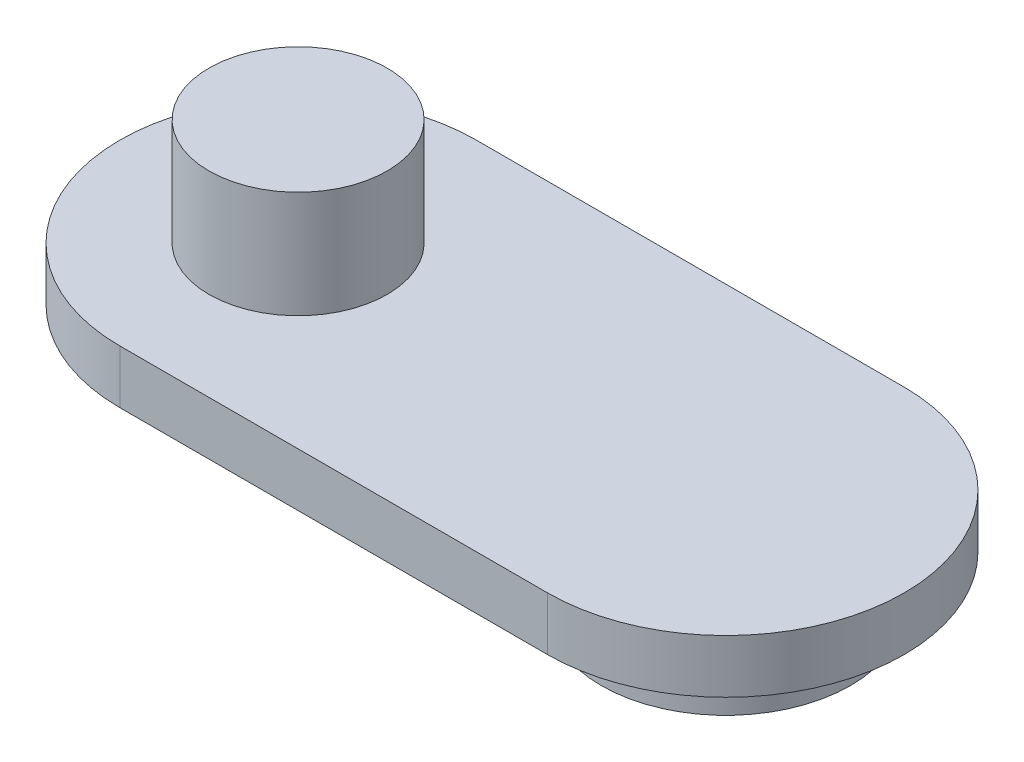
ISO-10303-21;
HEADER;
FILE_DESCRIPTION(('STEP AP214'),'2;1');
FILE_NAME('part.step','',(''),(''),'','','');
FILE_SCHEMA(('AUTOMOTIVE_DESIGN { 1 0 10303 214 1 1 1 1 }'));
ENDSEC;
DATA;
#1=APPLICATION_CONTEXT('core data for automotive mechanical design processes');
#2=APPLICATION_PROTOCOL_DEFINITION('international standard','automotive_design',2000,#1);
#3=PRODUCT_CONTEXT('',#1,'mechanical');
#4=PRODUCT('Part','Part','',(#3));
#5=PRODUCT_RELATED_PRODUCT_CATEGORY('part','',(#4));
#6=PRODUCT_DEFINITION_FORMATION('','',#4);
#7=PRODUCT_DEFINITION_CONTEXT('part definition',#1,'design');
#8=PRODUCT_DEFINITION('design','',#6,#7);
#9=PRODUCT_DEFINITION_SHAPE('','',#8);
#10=(LENGTH_UNIT() NAMED_UNIT(*) SI_UNIT(.MILLI.,.METRE.));
#11=(NAMED_UNIT(*) PLANE_ANGLE_UNIT() SI_UNIT($,.RADIAN.));
#12=(NAMED_UNIT(*) SI_UNIT($,.STERADIAN.) SOLID_ANGLE_UNIT());
#13=UNCERTAINTY_MEASURE_WITH_UNIT(LENGTH_MEASURE(1.E-05),#10,'distance_accuracy_value','');
#14=(GEOMETRIC_REPRESENTATION_CONTEXT(3) GLOBAL_UNCERTAINTY_ASSIGNED_CONTEXT((#13)) GLOBAL_UNIT_ASSIGNED_CONTEXT((#10,
#11,#12)) REPRESENTATION_CONTEXT('',''));
#15=CARTESIAN_POINT('',(0.,0.,0.));
#16=DIRECTION('',(0.,0.,1.));
#17=DIRECTION('',(1.,0.,0.));
#18=AXIS2_PLACEMENT_3D('',#15,#16,#17);
#19=CARTESIAN_POINT('',(0.,1.5,0.));
#20=DIRECTION('',(0.,-1.,0.));
#21=DIRECTION('',(0.,0.,-1.));
#22=AXIS2_PLACEMENT_3D('',#19,#20,#21);
#23=CYLINDRICAL_SURFACE('',#22,5.);
#24=CARTESIAN_POINT('',(0.,0.,0.));
#25=DIRECTION('',(0.,1.,0.));
#26=DIRECTION('',(0.,0.,1.));
#27=AXIS2_PLACEMENT_3D('',#24,#25,#26);
#28=CIRCLE('',#27,5.);
#29=CARTESIAN_POINT('',(0.,0.,-5.));
#30=VERTEX_POINT('',#29);
#31=CARTESIAN_POINT('',(0.,0.,5.));
#32=VERTEX_POINT('',#31);
#33=EDGE_CURVE('E102',#30,#32,#28,.T.);
#34=ORIENTED_EDGE('',*,*,#33,.T.);
#35=DIRECTION('',(0.,-1.,0.));
#36=VECTOR('',#35,1.);
#37=CARTESIAN_POINT('',(0.,1.5,5.));
#38=LINE('',#37,#36);
#39=CARTESIAN_POINT('',(0.,1.5,5.));
#40=VERTEX_POINT('',#39);
#41=EDGE_CURVE('E44',#40,#32,#38,.T.);
#42=ORIENTED_EDGE('',*,*,#41,.F.);
#43=CARTESIAN_POINT('',(0.,1.5,0.));
#44=DIRECTION('',(0.,1.,0.));
#45=DIRECTION('',(0.,0.,1.));
#46=AXIS2_PLACEMENT_3D('',#43,#44,#45);
#47=CIRCLE('',#46,5.);
#48=CARTESIAN_POINT('',(0.,1.5,-5.));
#49=VERTEX_POINT('',#48);
#50=EDGE_CURVE('E88',#49,#40,#47,.T.);
#51=ORIENTED_EDGE('',*,*,#50,.F.);
#52=DIRECTION('',(0.,-1.,0.));
#53=VECTOR('',#52,1.);
#54=CARTESIAN_POINT('',(0.,1.5,-5.));
#55=LINE('',#54,#53);
#56=EDGE_CURVE('E98',#49,#30,#55,.T.);
#57=ORIENTED_EDGE('',*,*,#56,.T.);
#58=EDGE_LOOP('',(#34,#42,#51,#57));
#59=FACE_BOUND('',#58,.T.);
#60=ADVANCED_FACE('F36',(#59),#23,.T.);
#61=CARTESIAN_POINT('',(0.,1.5,5.));
#62=DIRECTION('',(0.,0.,-1.));
#63=DIRECTION('',(-1.,0.,0.));
#64=AXIS2_PLACEMENT_3D('',#61,#62,#63);
#65=PLANE('',#64);
#66=DIRECTION('',(1.,0.,0.));
#67=VECTOR('',#66,1.);
#68=CARTESIAN_POINT('',(0.,0.,5.));
#69=LINE('',#68,#67);
#70=CARTESIAN_POINT('',(12.,0.,5.));
#71=VERTEX_POINT('',#70);
#72=EDGE_CURVE('E93',#32,#71,#69,.T.);
#73=ORIENTED_EDGE('',*,*,#72,.T.);
#74=DIRECTION('',(0.,-1.,0.));
#75=VECTOR('',#74,1.);
#76=CARTESIAN_POINT('',(12.,1.5,5.));
#77=LINE('',#76,#75);
#78=CARTESIAN_POINT('',(12.,1.5,5.));
#79=VERTEX_POINT('',#78);
#80=EDGE_CURVE('E91',#79,#71,#77,.T.);
#81=ORIENTED_EDGE('',*,*,#80,.F.);
#82=DIRECTION('',(1.,0.,0.));
#83=VECTOR('',#82,1.);
#84=CARTESIAN_POINT('',(0.,1.5,5.));
#85=LINE('',#84,#83);
#86=EDGE_CURVE('E83',#40,#79,#85,.T.);
#87=ORIENTED_EDGE('',*,*,#86,.F.);
#88=ORIENTED_EDGE('',*,*,#41,.T.);
#89=EDGE_LOOP('',(#73,#81,#87,#88));
#90=FACE_BOUND('',#89,.T.);
#91=ADVANCED_FACE('F92',(#90),#65,.F.);
#92=CARTESIAN_POINT('',(12.,1.5,0.));
#93=DIRECTION('',(0.,-1.,0.));
#94=DIRECTION('',(0.,0.,-1.));
#95=AXIS2_PLACEMENT_3D('',#92,#93,#94);
#96=CYLINDRICAL_SURFACE('',#95,5.);
#97=CARTESIAN_POINT('',(12.,0.,0.));
#98=DIRECTION('',(0.,1.,0.));
#99=DIRECTION('',(0.,0.,1.));
#100=AXIS2_PLACEMENT_3D('',#97,#98,#99);
#101=CIRCLE('',#100,5.);
#102=CARTESIAN_POINT('',(12.,0.,-5.));
#103=VERTEX_POINT('',#102);
#104=EDGE_CURVE('E69',#71,#103,#101,.T.);
#105=ORIENTED_EDGE('',*,*,#104,.T.);
#106=DIRECTION('',(0.,-1.,0.));
#107=VECTOR('',#106,1.);
#108=CARTESIAN_POINT('',(12.,1.5,-5.));
#109=LINE('',#108,#107);
#110=CARTESIAN_POINT('',(12.,1.5,-5.));
#111=VERTEX_POINT('',#110);
#112=EDGE_CURVE('E94',#111,#103,#109,.T.);
#113=ORIENTED_EDGE('',*,*,#112,.F.);
#114=CARTESIAN_POINT('',(12.,1.5,0.));
#115=DIRECTION('',(0.,1.,0.));
#116=DIRECTION('',(0.,0.,1.));
#117=AXIS2_PLACEMENT_3D('',#114,#115,#116);
#118=CIRCLE('',#117,5.);
#119=EDGE_CURVE('E86',#79,#111,#118,.T.);
#120=ORIENTED_EDGE('',*,*,#119,.F.);
#121=ORIENTED_EDGE('',*,*,#80,.T.);
#122=EDGE_LOOP('',(#105,#113,#120,#121));
#123=FACE_BOUND('',#122,.T.);
#124=ADVANCED_FACE('F96',(#123),#96,.T.);
#125=CARTESIAN_POINT('',(0.,1.5,-5.));
#126=DIRECTION('',(0.,0.,1.));
#127=DIRECTION('',(1.,0.,0.));
#128=AXIS2_PLACEMENT_3D('',#125,#126,#127);
#129=PLANE('',#128);
#130=DIRECTION('',(-1.,0.,0.));
#131=VECTOR('',#130,1.);
#132=CARTESIAN_POINT('',(0.,0.,-5.));
#133=LINE('',#132,#131);
#134=EDGE_CURVE('E75',#103,#30,#133,.T.);
#135=ORIENTED_EDGE('',*,*,#134,.T.);
#136=ORIENTED_EDGE('',*,*,#56,.F.);
#137=DIRECTION('',(-1.,0.,0.));
#138=VECTOR('',#137,1.);
#139=CARTESIAN_POINT('',(0.,1.5,-5.));
#140=LINE('',#139,#138);
#141=EDGE_CURVE('E52',#111,#49,#140,.T.);
#142=ORIENTED_EDGE('',*,*,#141,.F.);
#143=ORIENTED_EDGE('',*,*,#112,.T.);
#144=EDGE_LOOP('',(#135,#136,#142,#143));
#145=FACE_BOUND('',#144,.T.);
#146=ADVANCED_FACE('F125',(#145),#129,.F.);
#147=CARTESIAN_POINT('',(0.,1.5,0.));
#148=DIRECTION('',(0.,1.,0.));
#149=DIRECTION('',(0.,0.,1.));
#150=AXIS2_PLACEMENT_3D('',#147,#148,#149);
#151=PLANE('',#150);
#152=CARTESIAN_POINT('',(0.,1.5,0.));
#153=DIRECTION('',(0.,1.,0.));
#154=DIRECTION('',(0.,0.,1.));
#155=AXIS2_PLACEMENT_3D('',#152,#153,#154);
#156=CIRCLE('',#155,2.5);
#157=CARTESIAN_POINT('',(0.,1.5,2.5));
#158=VERTEX_POINT('',#157);
#159=EDGE_CURVE('E185',#158,#158,#156,.T.);
#160=ORIENTED_EDGE('',*,*,#159,.F.);
#161=EDGE_LOOP('',(#160));
#162=FACE_BOUND('',#161,.T.);
#163=ORIENTED_EDGE('',*,*,#50,.T.);
#164=ORIENTED_EDGE('',*,*,#86,.T.);
#165=ORIENTED_EDGE('',*,*,#119,.T.);
#166=ORIENTED_EDGE('',*,*,#141,.T.);
#167=EDGE_LOOP('',(#163,#164,#165,#166));
#168=FACE_BOUND('',#167,.T.);
#169=ADVANCED_FACE('F84',(#162,#168),#151,.T.);
#170=CARTESIAN_POINT('',(0.,0.,0.));
#171=DIRECTION('',(0.,1.,0.));
#172=DIRECTION('',(0.,0.,1.));
#173=AXIS2_PLACEMENT_3D('',#170,#171,#172);
#174=PLANE('',#173);
#175=CARTESIAN_POINT('',(12.,0.,0.));
#176=DIRECTION('',(0.,1.,0.));
#177=DIRECTION('',(0.,0.,1.));
#178=AXIS2_PLACEMENT_3D('',#175,#176,#177);
#179=CIRCLE('',#178,3.5);
#180=CARTESIAN_POINT('',(12.,0.,3.5));
#181=VERTEX_POINT('',#180);
#182=EDGE_CURVE('E11',#181,#181,#179,.F.);
#183=ORIENTED_EDGE('',*,*,#182,.F.);
#184=EDGE_LOOP('',(#183));
#185=FACE_BOUND('',#184,.T.);
#186=ORIENTED_EDGE('',*,*,#33,.F.);
#187=ORIENTED_EDGE('',*,*,#134,.F.);
#188=ORIENTED_EDGE('',*,*,#104,.F.);
#189=ORIENTED_EDGE('',*,*,#72,.F.);
#190=EDGE_LOOP('',(#186,#187,#188,#189));
#191=FACE_BOUND('',#190,.T.);
#192=ADVANCED_FACE('F113',(#185,#191),#174,.F.);
#193=CARTESIAN_POINT('',(12.,-1.5,0.));
#194=DIRECTION('',(0.,1.,0.));
#195=DIRECTION('',(0.,0.,1.));
#196=AXIS2_PLACEMENT_3D('',#193,#194,#195);
#197=CYLINDRICAL_SURFACE('',#196,3.5);
#198=CARTESIAN_POINT('',(12.,-1.5,0.));
#199=DIRECTION('',(0.,-1.,0.));
#200=DIRECTION('',(0.,0.,-1.));
#201=AXIS2_PLACEMENT_3D('',#198,#199,#200);
#202=CIRCLE('',#201,3.5);
#203=CARTESIAN_POINT('',(12.,-1.5,-3.5));
#204=VERTEX_POINT('',#203);
#205=EDGE_CURVE('E105',#204,#204,#202,.T.);
#206=ORIENTED_EDGE('',*,*,#205,.F.);
#207=EDGE_LOOP('',(#206));
#208=FACE_BOUND('',#207,.T.);
#209=ORIENTED_EDGE('',*,*,#182,.T.);
#210=EDGE_LOOP('',(#209));
#211=FACE_BOUND('',#210,.T.);
#212=ADVANCED_FACE('F115',(#208,#211),#197,.T.);
#213=CARTESIAN_POINT('',(12.,-1.5,0.));
#214=DIRECTION('',(0.,-1.,0.));
#215=DIRECTION('',(0.,0.,-1.));
#216=AXIS2_PLACEMENT_3D('',#213,#214,#215);
#217=PLANE('',#216);
#218=ORIENTED_EDGE('',*,*,#205,.T.);
#219=EDGE_LOOP('',(#218));
#220=FACE_BOUND('',#219,.T.);
#221=ADVANCED_FACE('F122',(#220),#217,.T.);
#222=CARTESIAN_POINT('',(0.,4.5,0.));
#223=DIRECTION('',(0.,-1.,0.));
#224=DIRECTION('',(0.,0.,-1.));
#225=AXIS2_PLACEMENT_3D('',#222,#223,#224);
#226=CYLINDRICAL_SURFACE('',#225,2.5);
#227=CARTESIAN_POINT('',(0.,4.5,0.));
#228=DIRECTION('',(0.,1.,0.));
#229=DIRECTION('',(0.,0.,1.));
#230=AXIS2_PLACEMENT_3D('',#227,#228,#229);
#231=CIRCLE('',#230,2.5);
#232=CARTESIAN_POINT('',(0.,4.5,2.5));
#233=VERTEX_POINT('',#232);
#234=EDGE_CURVE('E183',#233,#233,#231,.T.);
#235=ORIENTED_EDGE('',*,*,#234,.F.);
#236=EDGE_LOOP('',(#235));
#237=FACE_BOUND('',#236,.T.);
#238=ORIENTED_EDGE('',*,*,#159,.T.);
#239=EDGE_LOOP('',(#238));
#240=FACE_BOUND('',#239,.T.);
#241=ADVANCED_FACE('F158',(#237,#240),#226,.T.);
#242=CARTESIAN_POINT('',(0.,4.5,0.));
#243=DIRECTION('',(0.,1.,0.));
#244=DIRECTION('',(0.,0.,1.));
#245=AXIS2_PLACEMENT_3D('',#242,#243,#244);
#246=PLANE('',#245);
#247=ORIENTED_EDGE('',*,*,#234,.T.);
#248=EDGE_LOOP('',(#247));
#249=FACE_BOUND('',#248,.T.);
#250=ADVANCED_FACE('F163',(#249),#246,.T.);
#251=CLOSED_SHELL('',(#60,#91,#124,#146,#169,#192,#212,#221,#241,#250));
#252=MANIFOLD_SOLID_BREP('B2',#251);
#253=ADVANCED_BREP_SHAPE_REPRESENTATION('',(#18,#252),#14);
#254=SHAPE_DEFINITION_REPRESENTATION(#9,#253);
ENDSEC;
END-ISO-10303-21;
